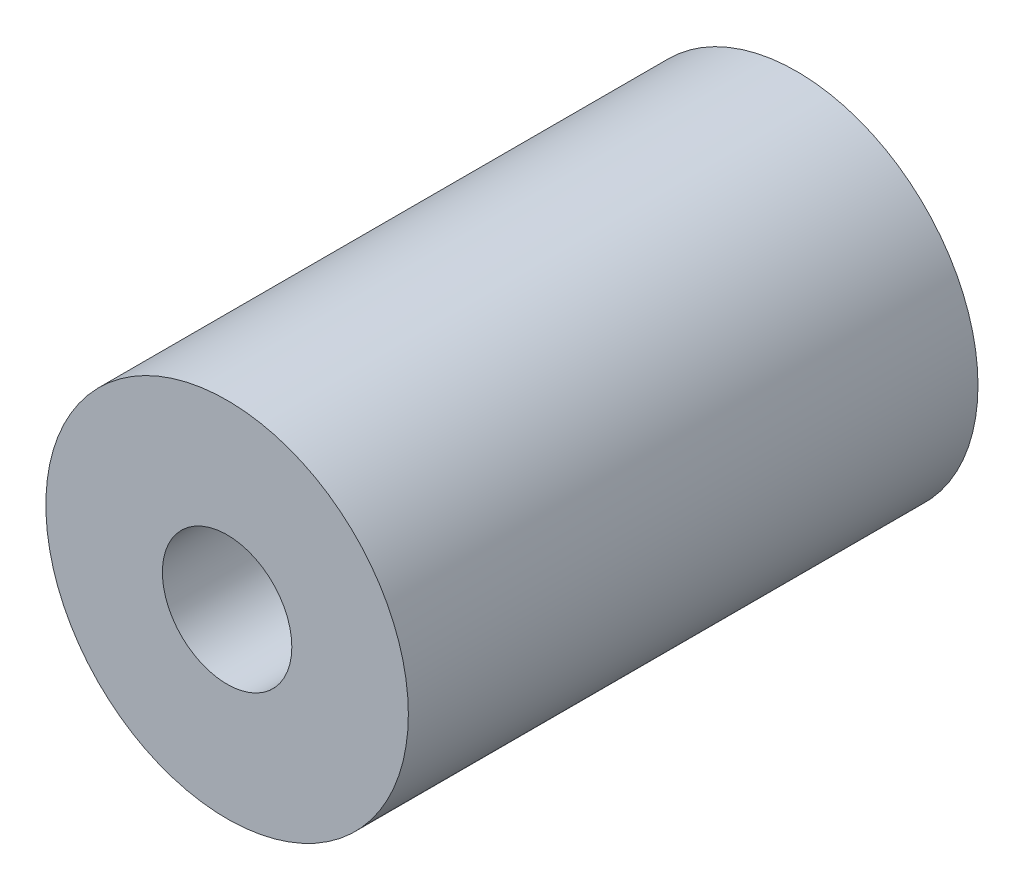
ISO-10303-21;
HEADER;
FILE_DESCRIPTION(('STEP AP214'),'2;1');
FILE_NAME('part.step','',(''),(''),'','','');
FILE_SCHEMA(('AUTOMOTIVE_DESIGN { 1 0 10303 214 1 1 1 1 }'));
ENDSEC;
DATA;
#1=APPLICATION_CONTEXT('core data for automotive mechanical design processes');
#2=APPLICATION_PROTOCOL_DEFINITION('international standard','automotive_design',2000,#1);
#3=PRODUCT_CONTEXT('',#1,'mechanical');
#4=PRODUCT('Part','Part','',(#3));
#5=PRODUCT_RELATED_PRODUCT_CATEGORY('part','',(#4));
#6=PRODUCT_DEFINITION_FORMATION('','',#4);
#7=PRODUCT_DEFINITION_CONTEXT('part definition',#1,'design');
#8=PRODUCT_DEFINITION('design','',#6,#7);
#9=PRODUCT_DEFINITION_SHAPE('','',#8);
#10=(LENGTH_UNIT() NAMED_UNIT(*) SI_UNIT(.MILLI.,.METRE.));
#11=(NAMED_UNIT(*) PLANE_ANGLE_UNIT() SI_UNIT($,.RADIAN.));
#12=(NAMED_UNIT(*) SI_UNIT($,.STERADIAN.) SOLID_ANGLE_UNIT());
#13=UNCERTAINTY_MEASURE_WITH_UNIT(LENGTH_MEASURE(1.E-05),#10,'distance_accuracy_value','');
#14=(GEOMETRIC_REPRESENTATION_CONTEXT(3) GLOBAL_UNCERTAINTY_ASSIGNED_CONTEXT((#13)) GLOBAL_UNIT_ASSIGNED_CONTEXT((#10,
#11,#12)) REPRESENTATION_CONTEXT('',''));
#15=CARTESIAN_POINT('',(0.,0.,0.));
#16=DIRECTION('',(0.,0.,1.));
#17=DIRECTION('',(1.,0.,0.));
#18=AXIS2_PLACEMENT_3D('',#15,#16,#17);
#19=CARTESIAN_POINT('',(0.,0.,11.));
#20=DIRECTION('',(0.,0.,-1.));
#21=DIRECTION('',(-1.,0.,0.));
#22=AXIS2_PLACEMENT_3D('',#19,#20,#21);
#23=CYLINDRICAL_SURFACE('',#22,7.);
#24=CARTESIAN_POINT('',(0.,0.,11.));
#25=DIRECTION('',(0.,0.,1.));
#26=DIRECTION('',(1.,0.,0.));
#27=AXIS2_PLACEMENT_3D('',#24,#25,#26);
#28=CIRCLE('',#27,7.);
#29=CARTESIAN_POINT('',(7.,0.,11.));
#30=VERTEX_POINT('',#29);
#31=EDGE_CURVE('E10',#30,#30,#28,.T.);
#32=ORIENTED_EDGE('',*,*,#31,.F.);
#33=EDGE_LOOP('',(#32));
#34=FACE_BOUND('',#33,.T.);
#35=CARTESIAN_POINT('',(0.,0.,-11.));
#36=DIRECTION('',(0.,0.,1.));
#37=DIRECTION('',(1.,0.,0.));
#38=AXIS2_PLACEMENT_3D('',#35,#36,#37);
#39=CIRCLE('',#38,7.);
#40=CARTESIAN_POINT('',(7.,0.,-11.));
#41=VERTEX_POINT('',#40);
#42=EDGE_CURVE('E36',#41,#41,#39,.T.);
#43=ORIENTED_EDGE('',*,*,#42,.T.);
#44=EDGE_LOOP('',(#43));
#45=FACE_BOUND('',#44,.T.);
#46=ADVANCED_FACE('F33',(#34,#45),#23,.T.);
#47=CARTESIAN_POINT('',(0.,0.,11.));
#48=DIRECTION('',(0.,0.,1.));
#49=DIRECTION('',(1.,0.,0.));
#50=AXIS2_PLACEMENT_3D('',#47,#48,#49);
#51=PLANE('',#50);
#52=CARTESIAN_POINT('',(0.,0.,11.));
#53=DIRECTION('',(0.,0.,1.));
#54=DIRECTION('',(1.,0.,0.));
#55=AXIS2_PLACEMENT_3D('',#52,#53,#54);
#56=CIRCLE('',#55,2.5);
#57=CARTESIAN_POINT('',(2.5,0.,11.));
#58=VERTEX_POINT('',#57);
#59=EDGE_CURVE('E45',#58,#58,#56,.T.);
#60=ORIENTED_EDGE('',*,*,#59,.F.);
#61=EDGE_LOOP('',(#60));
#62=FACE_BOUND('',#61,.T.);
#63=ORIENTED_EDGE('',*,*,#31,.T.);
#64=EDGE_LOOP('',(#63));
#65=FACE_BOUND('',#64,.T.);
#66=ADVANCED_FACE('F70',(#62,#65),#51,.T.);
#67=CARTESIAN_POINT('',(0.,0.,-11.));
#68=DIRECTION('',(0.,0.,1.));
#69=DIRECTION('',(1.,0.,0.));
#70=AXIS2_PLACEMENT_3D('',#67,#68,#69);
#71=PLANE('',#70);
#72=CARTESIAN_POINT('',(0.,0.,-11.));
#73=DIRECTION('',(0.,0.,-1.));
#74=DIRECTION('',(-1.,0.,0.));
#75=AXIS2_PLACEMENT_3D('',#72,#73,#74);
#76=CIRCLE('',#75,4.);
#77=CARTESIAN_POINT('',(-4.,0.,-11.));
#78=VERTEX_POINT('',#77);
#79=EDGE_CURVE('E51',#78,#78,#76,.T.);
#80=ORIENTED_EDGE('',*,*,#79,.F.);
#81=EDGE_LOOP('',(#80));
#82=FACE_BOUND('',#81,.T.);
#83=ORIENTED_EDGE('',*,*,#42,.F.);
#84=EDGE_LOOP('',(#83));
#85=FACE_BOUND('',#84,.T.);
#86=ADVANCED_FACE('F66',(#82,#85),#71,.F.);
#87=CARTESIAN_POINT('',(0.,0.,4.5));
#88=DIRECTION('',(0.,0.,1.));
#89=DIRECTION('',(1.,0.,0.));
#90=AXIS2_PLACEMENT_3D('',#87,#88,#89);
#91=CYLINDRICAL_SURFACE('',#90,2.5);
#92=CARTESIAN_POINT('',(0.,0.,4.5));
#93=DIRECTION('',(0.,0.,1.));
#94=DIRECTION('',(1.,0.,0.));
#95=AXIS2_PLACEMENT_3D('',#92,#93,#94);
#96=CIRCLE('',#95,2.5);
#97=CARTESIAN_POINT('',(2.5,0.,4.5));
#98=VERTEX_POINT('',#97);
#99=EDGE_CURVE('E43',#98,#98,#96,.T.);
#100=CARTESIAN_POINT('',(2.5,0.,4.5));
#101=CARTESIAN_POINT('',(2.5,0.,4.56770833333333));
#102=CARTESIAN_POINT('',(2.5,0.,4.63541666666667));
#103=CARTESIAN_POINT('',(2.5,0.,4.77083333333333));
#104=CARTESIAN_POINT('',(2.5,0.,4.83854166666667));
#105=CARTESIAN_POINT('',(2.5,0.,4.97395833333333));
#106=CARTESIAN_POINT('',(2.5,0.,5.04166666666667));
#107=CARTESIAN_POINT('',(2.5,0.,5.17708333333333));
#108=CARTESIAN_POINT('',(2.5,0.,5.24479166666667));
#109=CARTESIAN_POINT('',(2.5,0.,5.38020833333333));
#110=CARTESIAN_POINT('',(2.5,0.,5.44791666666667));
#111=CARTESIAN_POINT('',(2.5,0.,5.58333333333333));
#112=CARTESIAN_POINT('',(2.5,0.,5.65104166666667));
#113=CARTESIAN_POINT('',(2.5,0.,5.78645833333333));
#114=CARTESIAN_POINT('',(2.5,0.,5.85416666666667));
#115=CARTESIAN_POINT('',(2.5,0.,5.98958333333333));
#116=CARTESIAN_POINT('',(2.5,0.,6.05729166666667));
#117=CARTESIAN_POINT('',(2.5,0.,6.19270833333333));
#118=CARTESIAN_POINT('',(2.5,0.,6.26041666666667));
#119=CARTESIAN_POINT('',(2.5,0.,6.39583333333333));
#120=CARTESIAN_POINT('',(2.5,0.,6.46354166666667));
#121=CARTESIAN_POINT('',(2.5,0.,6.59895833333333));
#122=CARTESIAN_POINT('',(2.5,0.,6.66666666666667));
#123=CARTESIAN_POINT('',(2.5,0.,6.80208333333333));
#124=CARTESIAN_POINT('',(2.5,0.,6.86979166666666));
#125=CARTESIAN_POINT('',(2.5,0.,7.00520833333333));
#126=CARTESIAN_POINT('',(2.5,0.,7.07291666666667));
#127=CARTESIAN_POINT('',(2.5,0.,7.20833333333333));
#128=CARTESIAN_POINT('',(2.5,0.,7.27604166666667));
#129=CARTESIAN_POINT('',(2.5,0.,7.41145833333333));
#130=CARTESIAN_POINT('',(2.5,0.,7.47916666666666));
#131=CARTESIAN_POINT('',(2.5,0.,7.61458333333333));
#132=CARTESIAN_POINT('',(2.5,0.,7.68229166666666));
#133=CARTESIAN_POINT('',(2.5,0.,7.81770833333333));
#134=CARTESIAN_POINT('',(2.5,0.,7.88541666666667));
#135=CARTESIAN_POINT('',(2.5,0.,8.02083333333333));
#136=CARTESIAN_POINT('',(2.5,0.,8.08854166666667));
#137=CARTESIAN_POINT('',(2.5,0.,8.22395833333333));
#138=CARTESIAN_POINT('',(2.5,0.,8.29166666666667));
#139=CARTESIAN_POINT('',(2.5,0.,8.42708333333333));
#140=CARTESIAN_POINT('',(2.5,0.,8.49479166666666));
#141=CARTESIAN_POINT('',(2.5,0.,8.63020833333333));
#142=CARTESIAN_POINT('',(2.5,0.,8.69791666666666));
#143=CARTESIAN_POINT('',(2.5,0.,8.83333333333333));
#144=CARTESIAN_POINT('',(2.5,0.,8.90104166666666));
#145=CARTESIAN_POINT('',(2.5,0.,9.03645833333333));
#146=CARTESIAN_POINT('',(2.5,0.,9.10416666666666));
#147=CARTESIAN_POINT('',(2.5,0.,9.23958333333333));
#148=CARTESIAN_POINT('',(2.5,0.,9.30729166666666));
#149=CARTESIAN_POINT('',(2.5,0.,9.44270833333333));
#150=CARTESIAN_POINT('',(2.5,0.,9.51041666666667));
#151=CARTESIAN_POINT('',(2.5,0.,9.64583333333333));
#152=CARTESIAN_POINT('',(2.5,0.,9.71354166666667));
#153=CARTESIAN_POINT('',(2.5,0.,9.84895833333333));
#154=CARTESIAN_POINT('',(2.5,0.,9.91666666666666));
#155=CARTESIAN_POINT('',(2.5,0.,10.0520833333333));
#156=CARTESIAN_POINT('',(2.5,0.,10.1197916666667));
#157=CARTESIAN_POINT('',(2.5,0.,10.2552083333333));
#158=CARTESIAN_POINT('',(2.5,0.,10.3229166666667));
#159=CARTESIAN_POINT('',(2.5,0.,10.4583333333333));
#160=CARTESIAN_POINT('',(2.5,0.,10.5260416666667));
#161=CARTESIAN_POINT('',(2.5,0.,10.6614583333333));
#162=CARTESIAN_POINT('',(2.5,0.,10.7291666666667));
#163=CARTESIAN_POINT('',(2.5,0.,10.8645833333333));
#164=CARTESIAN_POINT('',(2.5,0.,10.9322916666667));
#165=CARTESIAN_POINT('',(2.5,0.,11.));
#166=B_SPLINE_CURVE_WITH_KNOTS('',3,(#100,#101,#102,#103,#104,#105,#106,#107,#108,#109,#110,
#111,#112,#113,#114,#115,#116,#117,#118,#119,#120,#121,#122,#123,#124,#125,#126,#127,#128,#129,
#130,#131,#132,#133,#134,#135,#136,#137,#138,#139,#140,#141,#142,#143,#144,#145,#146,#147,#148,
#149,#150,#151,#152,#153,#154,#155,#156,#157,#158,#159,#160,#161,#162,#163,#164,#165),
.UNSPECIFIED.,.F.,.F.,(4,2,2,2,2,2,2,2,2,2,2,2,2,2,2,2,2,2,2,2,2,2,2,2,2,2,2,2,2,2,2,2,4),(0.,
0.203124999999999,0.40625,0.609375,0.812499999999999,1.015625,1.21875,1.421875,1.625,1.828125,
2.03125,2.234375,2.4375,2.640625,2.84375,3.046875,3.25,3.453125,3.65625,3.859375,4.0625,
4.265625,4.46875,4.671875,4.875,5.078125,5.28125,5.484375,5.6875,5.890625,6.09375,6.296875,6.5),.UNSPECIFIED.);
#167=EDGE_CURVE('BSEAM69',#98,#58,#166,.T.);
#168=ORIENTED_EDGE('',*,*,#99,.F.);
#169=ORIENTED_EDGE('',*,*,#59,.T.);
#170=ORIENTED_EDGE('',*,*,#167,.T.);
#171=ORIENTED_EDGE('',*,*,#167,.F.);
#172=EDGE_LOOP('',(#168,#170,#169,#171));
#173=FACE_BOUND('',#172,.T.);
#174=ADVANCED_FACE('F69',(#173),#91,.F.);
#175=CARTESIAN_POINT('',(0.,0.,4.5));
#176=DIRECTION('',(0.,0.,1.));
#177=DIRECTION('',(1.,0.,0.));
#178=AXIS2_PLACEMENT_3D('',#175,#176,#177);
#179=PLANE('',#178);
#180=ORIENTED_EDGE('',*,*,#99,.T.);
#181=EDGE_LOOP('',(#180));
#182=FACE_BOUND('',#181,.T.);
#183=ADVANCED_FACE('F62',(#182),#179,.T.);
#184=CARTESIAN_POINT('',(0.,0.,-4.5));
#185=DIRECTION('',(0.,0.,-1.));
#186=DIRECTION('',(-1.,0.,0.));
#187=AXIS2_PLACEMENT_3D('',#184,#185,#186);
#188=CYLINDRICAL_SURFACE('',#187,4.);
#189=CARTESIAN_POINT('',(0.,0.,-4.5));
#190=DIRECTION('',(0.,0.,-1.));
#191=DIRECTION('',(-1.,0.,0.));
#192=AXIS2_PLACEMENT_3D('',#189,#190,#191);
#193=CIRCLE('',#192,4.);
#194=CARTESIAN_POINT('',(-4.,0.,-4.5));
#195=VERTEX_POINT('',#194);
#196=EDGE_CURVE('E48',#195,#195,#193,.T.);
#197=CARTESIAN_POINT('',(-4.,0.,-4.5));
#198=CARTESIAN_POINT('',(-4.,0.,-4.56770833333333));
#199=CARTESIAN_POINT('',(-4.,0.,-4.63541666666667));
#200=CARTESIAN_POINT('',(-4.,0.,-4.77083333333333));
#201=CARTESIAN_POINT('',(-4.,0.,-4.83854166666667));
#202=CARTESIAN_POINT('',(-4.,0.,-4.97395833333333));
#203=CARTESIAN_POINT('',(-4.,0.,-5.04166666666667));
#204=CARTESIAN_POINT('',(-4.,0.,-5.17708333333333));
#205=CARTESIAN_POINT('',(-4.,0.,-5.24479166666667));
#206=CARTESIAN_POINT('',(-4.,0.,-5.38020833333333));
#207=CARTESIAN_POINT('',(-4.,0.,-5.44791666666667));
#208=CARTESIAN_POINT('',(-4.,0.,-5.58333333333333));
#209=CARTESIAN_POINT('',(-4.,0.,-5.65104166666667));
#210=CARTESIAN_POINT('',(-4.,0.,-5.78645833333333));
#211=CARTESIAN_POINT('',(-4.,0.,-5.85416666666667));
#212=CARTESIAN_POINT('',(-4.,0.,-5.98958333333333));
#213=CARTESIAN_POINT('',(-4.,0.,-6.05729166666667));
#214=CARTESIAN_POINT('',(-4.,0.,-6.19270833333333));
#215=CARTESIAN_POINT('',(-4.,0.,-6.26041666666667));
#216=CARTESIAN_POINT('',(-4.,0.,-6.39583333333333));
#217=CARTESIAN_POINT('',(-4.,0.,-6.46354166666667));
#218=CARTESIAN_POINT('',(-4.,0.,-6.59895833333333));
#219=CARTESIAN_POINT('',(-4.,0.,-6.66666666666667));
#220=CARTESIAN_POINT('',(-4.,0.,-6.80208333333333));
#221=CARTESIAN_POINT('',(-4.,0.,-6.86979166666666));
#222=CARTESIAN_POINT('',(-4.,0.,-7.00520833333333));
#223=CARTESIAN_POINT('',(-4.,0.,-7.07291666666667));
#224=CARTESIAN_POINT('',(-4.,0.,-7.20833333333333));
#225=CARTESIAN_POINT('',(-4.,0.,-7.27604166666667));
#226=CARTESIAN_POINT('',(-4.,0.,-7.41145833333333));
#227=CARTESIAN_POINT('',(-4.,0.,-7.47916666666666));
#228=CARTESIAN_POINT('',(-4.,0.,-7.61458333333333));
#229=CARTESIAN_POINT('',(-4.,0.,-7.68229166666666));
#230=CARTESIAN_POINT('',(-4.,0.,-7.81770833333333));
#231=CARTESIAN_POINT('',(-4.,0.,-7.88541666666667));
#232=CARTESIAN_POINT('',(-4.,0.,-8.02083333333333));
#233=CARTESIAN_POINT('',(-4.,0.,-8.08854166666667));
#234=CARTESIAN_POINT('',(-4.,0.,-8.22395833333333));
#235=CARTESIAN_POINT('',(-4.,0.,-8.29166666666667));
#236=CARTESIAN_POINT('',(-4.,0.,-8.42708333333333));
#237=CARTESIAN_POINT('',(-4.,0.,-8.49479166666666));
#238=CARTESIAN_POINT('',(-4.,0.,-8.63020833333333));
#239=CARTESIAN_POINT('',(-4.,0.,-8.69791666666666));
#240=CARTESIAN_POINT('',(-4.,0.,-8.83333333333333));
#241=CARTESIAN_POINT('',(-4.,0.,-8.90104166666666));
#242=CARTESIAN_POINT('',(-4.,0.,-9.03645833333333));
#243=CARTESIAN_POINT('',(-4.,0.,-9.10416666666666));
#244=CARTESIAN_POINT('',(-4.,0.,-9.23958333333333));
#245=CARTESIAN_POINT('',(-4.,0.,-9.30729166666666));
#246=CARTESIAN_POINT('',(-4.,0.,-9.44270833333333));
#247=CARTESIAN_POINT('',(-4.,0.,-9.51041666666667));
#248=CARTESIAN_POINT('',(-4.,0.,-9.64583333333333));
#249=CARTESIAN_POINT('',(-4.,0.,-9.71354166666667));
#250=CARTESIAN_POINT('',(-4.,0.,-9.84895833333333));
#251=CARTESIAN_POINT('',(-4.,0.,-9.91666666666666));
#252=CARTESIAN_POINT('',(-4.,0.,-10.0520833333333));
#253=CARTESIAN_POINT('',(-4.,0.,-10.1197916666667));
#254=CARTESIAN_POINT('',(-4.,0.,-10.2552083333333));
#255=CARTESIAN_POINT('',(-4.,0.,-10.3229166666667));
#256=CARTESIAN_POINT('',(-4.,0.,-10.4583333333333));
#257=CARTESIAN_POINT('',(-4.,0.,-10.5260416666667));
#258=CARTESIAN_POINT('',(-4.,0.,-10.6614583333333));
#259=CARTESIAN_POINT('',(-4.,0.,-10.7291666666667));
#260=CARTESIAN_POINT('',(-4.,0.,-10.8645833333333));
#261=CARTESIAN_POINT('',(-4.,0.,-10.9322916666667));
#262=CARTESIAN_POINT('',(-4.,0.,-11.));
#263=B_SPLINE_CURVE_WITH_KNOTS('',3,(#197,#198,#199,#200,#201,#202,#203,#204,#205,#206,#207,
#208,#209,#210,#211,#212,#213,#214,#215,#216,#217,#218,#219,#220,#221,#222,#223,#224,#225,#226,
#227,#228,#229,#230,#231,#232,#233,#234,#235,#236,#237,#238,#239,#240,#241,#242,#243,#244,#245,
#246,#247,#248,#249,#250,#251,#252,#253,#254,#255,#256,#257,#258,#259,#260,#261,#262),
.UNSPECIFIED.,.F.,.F.,(4,2,2,2,2,2,2,2,2,2,2,2,2,2,2,2,2,2,2,2,2,2,2,2,2,2,2,2,2,2,2,2,4),(0.,
0.203124999999999,0.40625,0.609375,0.812499999999999,1.015625,1.21875,1.421875,1.625,1.828125,
2.03125,2.234375,2.4375,2.640625,2.84375,3.046875,3.25,3.453125,3.65625,3.859375,4.0625,
4.265625,4.46875,4.671875,4.875,5.078125,5.28125,5.484375,5.6875,5.890625,6.09375,6.296875,6.5),.UNSPECIFIED.);
#264=EDGE_CURVE('BSEAM59',#195,#78,#263,.T.);
#265=ORIENTED_EDGE('',*,*,#196,.F.);
#266=ORIENTED_EDGE('',*,*,#79,.T.);
#267=ORIENTED_EDGE('',*,*,#264,.T.);
#268=ORIENTED_EDGE('',*,*,#264,.F.);
#269=EDGE_LOOP('',(#265,#267,#266,#268));
#270=FACE_BOUND('',#269,.T.);
#271=ADVANCED_FACE('F59',(#270),#188,.F.);
#272=CARTESIAN_POINT('',(0.,0.,-4.5));
#273=DIRECTION('',(0.,0.,-1.));
#274=DIRECTION('',(-1.,0.,0.));
#275=AXIS2_PLACEMENT_3D('',#272,#273,#274);
#276=PLANE('',#275);
#277=ORIENTED_EDGE('',*,*,#196,.T.);
#278=EDGE_LOOP('',(#277));
#279=FACE_BOUND('',#278,.T.);
#280=ADVANCED_FACE('F57',(#279),#276,.T.);
#281=CLOSED_SHELL('',(#46,#66,#86,#174,#183,#271,#280));
#282=MANIFOLD_SOLID_BREP('B2',#281);
#283=ADVANCED_BREP_SHAPE_REPRESENTATION('',(#18,#282),#14);
#284=SHAPE_DEFINITION_REPRESENTATION(#9,#283);
ENDSEC;
END-ISO-10303-21;
